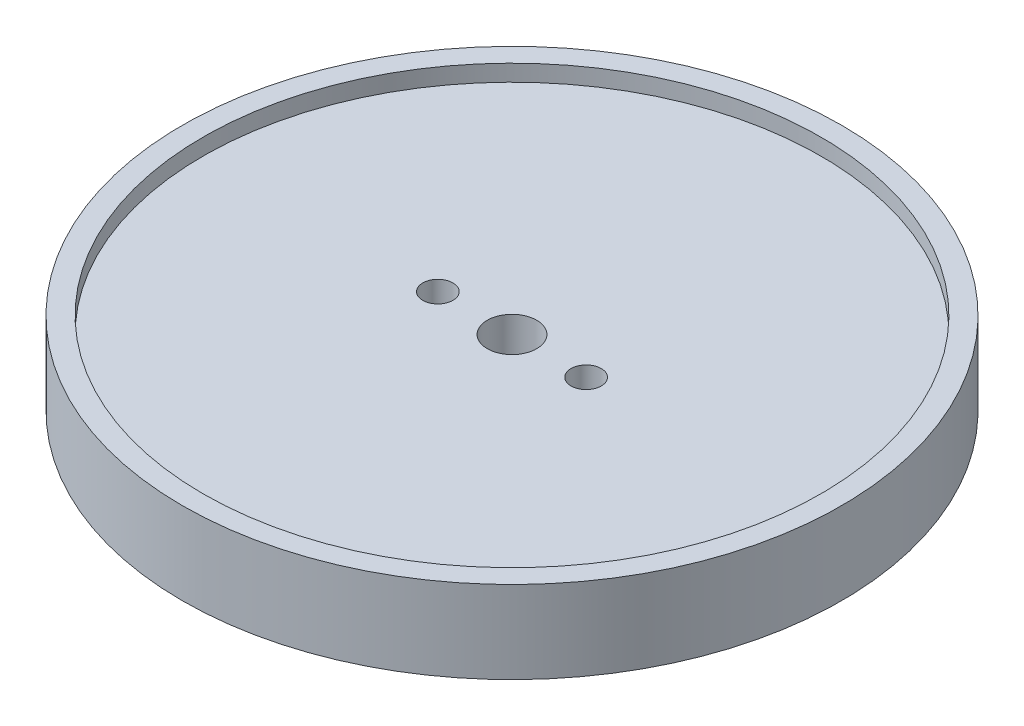
ISO-10303-21;
HEADER;
FILE_DESCRIPTION(('STEP AP214'),'2;1');
FILE_NAME('part.step','',(''),(''),'','','');
FILE_SCHEMA(('AUTOMOTIVE_DESIGN { 1 0 10303 214 1 1 1 1 }'));
ENDSEC;
DATA;
#1=APPLICATION_CONTEXT('core data for automotive mechanical design processes');
#2=APPLICATION_PROTOCOL_DEFINITION('international standard','automotive_design',2000,#1);
#3=PRODUCT_CONTEXT('',#1,'mechanical');
#4=PRODUCT('Part','Part','',(#3));
#5=PRODUCT_RELATED_PRODUCT_CATEGORY('part','',(#4));
#6=PRODUCT_DEFINITION_FORMATION('','',#4);
#7=PRODUCT_DEFINITION_CONTEXT('part definition',#1,'design');
#8=PRODUCT_DEFINITION('design','',#6,#7);
#9=PRODUCT_DEFINITION_SHAPE('','',#8);
#10=(LENGTH_UNIT() NAMED_UNIT(*) SI_UNIT(.MILLI.,.METRE.));
#11=(NAMED_UNIT(*) PLANE_ANGLE_UNIT() SI_UNIT($,.RADIAN.));
#12=(NAMED_UNIT(*) SI_UNIT($,.STERADIAN.) SOLID_ANGLE_UNIT());
#13=UNCERTAINTY_MEASURE_WITH_UNIT(LENGTH_MEASURE(1.E-05),#10,'distance_accuracy_value','');
#14=(GEOMETRIC_REPRESENTATION_CONTEXT(3) GLOBAL_UNCERTAINTY_ASSIGNED_CONTEXT((#13)) GLOBAL_UNIT_ASSIGNED_CONTEXT((#10,
#11,#12)) REPRESENTATION_CONTEXT('',''));
#15=CARTESIAN_POINT('',(0.,0.,0.));
#16=DIRECTION('',(0.,0.,1.));
#17=DIRECTION('',(1.,0.,0.));
#18=AXIS2_PLACEMENT_3D('',#15,#16,#17);
#19=CARTESIAN_POINT('',(0.,10.,0.));
#20=DIRECTION('',(0.,-1.,0.));
#21=DIRECTION('',(0.,0.,-1.));
#22=AXIS2_PLACEMENT_3D('',#19,#20,#21);
#23=CYLINDRICAL_SURFACE('',#22,37.5);
#24=CARTESIAN_POINT('',(0.,8.,0.));
#25=DIRECTION('',(0.,1.,0.));
#26=DIRECTION('',(0.,0.,1.));
#27=AXIS2_PLACEMENT_3D('',#24,#25,#26);
#28=CIRCLE('',#27,37.5);
#29=CARTESIAN_POINT('',(0.,8.,37.5));
#30=VERTEX_POINT('',#29);
#31=EDGE_CURVE('E10',#30,#30,#28,.T.);
#32=ORIENTED_EDGE('',*,*,#31,.F.);
#33=EDGE_LOOP('',(#32));
#34=FACE_BOUND('',#33,.T.);
#35=CARTESIAN_POINT('',(0.,10.,0.));
#36=DIRECTION('',(0.,1.,0.));
#37=DIRECTION('',(0.,0.,1.));
#38=AXIS2_PLACEMENT_3D('',#35,#36,#37);
#39=CIRCLE('',#38,37.5);
#40=CARTESIAN_POINT('',(0.,10.,37.5));
#41=VERTEX_POINT('',#40);
#42=EDGE_CURVE('E49',#41,#41,#39,.T.);
#43=ORIENTED_EDGE('',*,*,#42,.T.);
#44=EDGE_LOOP('',(#43));
#45=FACE_BOUND('',#44,.T.);
#46=ADVANCED_FACE('F39',(#34,#45),#23,.F.);
#47=CARTESIAN_POINT('',(0.,10.,0.));
#48=DIRECTION('',(0.,-1.,0.));
#49=DIRECTION('',(0.,0.,-1.));
#50=AXIS2_PLACEMENT_3D('',#47,#48,#49);
#51=CYLINDRICAL_SURFACE('',#50,40.);
#52=CARTESIAN_POINT('',(0.,10.,0.));
#53=DIRECTION('',(0.,1.,0.));
#54=DIRECTION('',(0.,0.,1.));
#55=AXIS2_PLACEMENT_3D('',#52,#53,#54);
#56=CIRCLE('',#55,40.);
#57=CARTESIAN_POINT('',(0.,10.,40.));
#58=VERTEX_POINT('',#57);
#59=EDGE_CURVE('E45',#58,#58,#56,.T.);
#60=ORIENTED_EDGE('',*,*,#59,.F.);
#61=EDGE_LOOP('',(#60));
#62=FACE_BOUND('',#61,.T.);
#63=CARTESIAN_POINT('',(0.,0.,0.));
#64=DIRECTION('',(0.,1.,0.));
#65=DIRECTION('',(0.,0.,1.));
#66=AXIS2_PLACEMENT_3D('',#63,#64,#65);
#67=CIRCLE('',#66,40.);
#68=CARTESIAN_POINT('',(0.,0.,40.));
#69=VERTEX_POINT('',#68);
#70=EDGE_CURVE('E54',#69,#69,#67,.T.);
#71=ORIENTED_EDGE('',*,*,#70,.T.);
#72=EDGE_LOOP('',(#71));
#73=FACE_BOUND('',#72,.T.);
#74=ADVANCED_FACE('F110',(#62,#73),#51,.T.);
#75=CARTESIAN_POINT('',(0.,10.,0.));
#76=DIRECTION('',(0.,1.,0.));
#77=DIRECTION('',(0.,0.,1.));
#78=AXIS2_PLACEMENT_3D('',#75,#76,#77);
#79=PLANE('',#78);
#80=ORIENTED_EDGE('',*,*,#42,.F.);
#81=EDGE_LOOP('',(#80));
#82=FACE_BOUND('',#81,.T.);
#83=ORIENTED_EDGE('',*,*,#59,.T.);
#84=EDGE_LOOP('',(#83));
#85=FACE_BOUND('',#84,.T.);
#86=ADVANCED_FACE('F97',(#82,#85),#79,.T.);
#87=CARTESIAN_POINT('',(0.,0.,0.));
#88=DIRECTION('',(0.,1.,0.));
#89=DIRECTION('',(0.,0.,1.));
#90=AXIS2_PLACEMENT_3D('',#87,#88,#89);
#91=PLANE('',#90);
#92=ORIENTED_EDGE('',*,*,#70,.F.);
#93=EDGE_LOOP('',(#92));
#94=FACE_BOUND('',#93,.T.);
#95=CARTESIAN_POINT('',(-9.,0.,0.));
#96=DIRECTION('',(0.,1.,0.));
#97=DIRECTION('',(0.,0.,1.));
#98=AXIS2_PLACEMENT_3D('',#95,#96,#97);
#99=CIRCLE('',#98,1.835);
#100=CARTESIAN_POINT('',(-9.,0.,1.835));
#101=VERTEX_POINT('',#100);
#102=EDGE_CURVE('E71',#101,#101,#99,.F.);
#103=ORIENTED_EDGE('',*,*,#102,.F.);
#104=EDGE_LOOP('',(#103));
#105=FACE_BOUND('',#104,.T.);
#106=CARTESIAN_POINT('',(9.,0.,0.));
#107=DIRECTION('',(0.,1.,0.));
#108=DIRECTION('',(0.,0.,1.));
#109=AXIS2_PLACEMENT_3D('',#106,#107,#108);
#110=CIRCLE('',#109,1.835);
#111=CARTESIAN_POINT('',(9.,0.,1.835));
#112=VERTEX_POINT('',#111);
#113=EDGE_CURVE('E74',#112,#112,#110,.T.);
#114=ORIENTED_EDGE('',*,*,#113,.T.);
#115=EDGE_LOOP('',(#114));
#116=FACE_BOUND('',#115,.T.);
#117=CARTESIAN_POINT('',(0.,0.,0.));
#118=DIRECTION('',(0.,1.,0.));
#119=DIRECTION('',(0.,0.,1.));
#120=AXIS2_PLACEMENT_3D('',#117,#118,#119);
#121=CIRCLE('',#120,3.);
#122=CARTESIAN_POINT('',(0.,0.,3.));
#123=VERTEX_POINT('',#122);
#124=EDGE_CURVE('E76',#123,#123,#121,.T.);
#125=ORIENTED_EDGE('',*,*,#124,.T.);
#126=EDGE_LOOP('',(#125));
#127=FACE_BOUND('',#126,.T.);
#128=ADVANCED_FACE('F93',(#94,#105,#116,#127),#91,.F.);
#129=CARTESIAN_POINT('',(0.,8.,0.));
#130=DIRECTION('',(0.,-1.,0.));
#131=DIRECTION('',(0.,0.,-1.));
#132=AXIS2_PLACEMENT_3D('',#129,#130,#131);
#133=CYLINDRICAL_SURFACE('',#132,3.);
#134=CARTESIAN_POINT('',(0.,8.,0.));
#135=DIRECTION('',(0.,1.,0.));
#136=DIRECTION('',(0.,0.,1.));
#137=AXIS2_PLACEMENT_3D('',#134,#135,#136);
#138=CIRCLE('',#137,3.);
#139=CARTESIAN_POINT('',(0.,8.,3.));
#140=VERTEX_POINT('',#139);
#141=EDGE_CURVE('E58',#140,#140,#138,.T.);
#142=ORIENTED_EDGE('',*,*,#141,.T.);
#143=EDGE_LOOP('',(#142));
#144=FACE_BOUND('',#143,.T.);
#145=ORIENTED_EDGE('',*,*,#124,.F.);
#146=EDGE_LOOP('',(#145));
#147=FACE_BOUND('',#146,.T.);
#148=ADVANCED_FACE('F96',(#144,#147),#133,.F.);
#149=CARTESIAN_POINT('',(9.,8.,0.));
#150=DIRECTION('',(0.,-1.,0.));
#151=DIRECTION('',(0.,0.,-1.));
#152=AXIS2_PLACEMENT_3D('',#149,#150,#151);
#153=CYLINDRICAL_SURFACE('',#152,1.835);
#154=CARTESIAN_POINT('',(9.,8.,0.));
#155=DIRECTION('',(0.,1.,0.));
#156=DIRECTION('',(0.,0.,1.));
#157=AXIS2_PLACEMENT_3D('',#154,#155,#156);
#158=CIRCLE('',#157,1.835);
#159=CARTESIAN_POINT('',(9.,8.,1.835));
#160=VERTEX_POINT('',#159);
#161=EDGE_CURVE('E62',#160,#160,#158,.T.);
#162=ORIENTED_EDGE('',*,*,#161,.T.);
#163=EDGE_LOOP('',(#162));
#164=FACE_BOUND('',#163,.T.);
#165=ORIENTED_EDGE('',*,*,#113,.F.);
#166=EDGE_LOOP('',(#165));
#167=FACE_BOUND('',#166,.T.);
#168=ADVANCED_FACE('F89',(#164,#167),#153,.F.);
#169=CARTESIAN_POINT('',(-9.,8.,0.));
#170=DIRECTION('',(0.,-1.,0.));
#171=DIRECTION('',(0.,0.,-1.));
#172=AXIS2_PLACEMENT_3D('',#169,#170,#171);
#173=CYLINDRICAL_SURFACE('',#172,1.835);
#174=CARTESIAN_POINT('',(-9.,8.,0.));
#175=DIRECTION('',(0.,1.,0.));
#176=DIRECTION('',(0.,0.,1.));
#177=AXIS2_PLACEMENT_3D('',#174,#175,#176);
#178=CIRCLE('',#177,1.835);
#179=CARTESIAN_POINT('',(-9.,8.,1.835));
#180=VERTEX_POINT('',#179);
#181=EDGE_CURVE('E67',#180,#180,#178,.F.);
#182=ORIENTED_EDGE('',*,*,#181,.F.);
#183=EDGE_LOOP('',(#182));
#184=FACE_BOUND('',#183,.T.);
#185=ORIENTED_EDGE('',*,*,#102,.T.);
#186=EDGE_LOOP('',(#185));
#187=FACE_BOUND('',#186,.T.);
#188=ADVANCED_FACE('F86',(#184,#187),#173,.F.);
#189=CARTESIAN_POINT('',(0.,8.,0.));
#190=DIRECTION('',(0.,1.,0.));
#191=DIRECTION('',(0.,0.,1.));
#192=AXIS2_PLACEMENT_3D('',#189,#190,#191);
#193=PLANE('',#192);
#194=ORIENTED_EDGE('',*,*,#181,.T.);
#195=EDGE_LOOP('',(#194));
#196=FACE_BOUND('',#195,.T.);
#197=ORIENTED_EDGE('',*,*,#161,.F.);
#198=EDGE_LOOP('',(#197));
#199=FACE_BOUND('',#198,.T.);
#200=ORIENTED_EDGE('',*,*,#141,.F.);
#201=EDGE_LOOP('',(#200));
#202=FACE_BOUND('',#201,.T.);
#203=ORIENTED_EDGE('',*,*,#31,.T.);
#204=EDGE_LOOP('',(#203));
#205=FACE_BOUND('',#204,.T.);
#206=ADVANCED_FACE('F83',(#196,#199,#202,#205),#193,.T.);
#207=CLOSED_SHELL('',(#46,#74,#86,#128,#148,#168,#188,#206));
#208=MANIFOLD_SOLID_BREP('B2',#207);
#209=ADVANCED_BREP_SHAPE_REPRESENTATION('',(#18,#208),#14);
#210=SHAPE_DEFINITION_REPRESENTATION(#9,#209);
ENDSEC;
END-ISO-10303-21;
